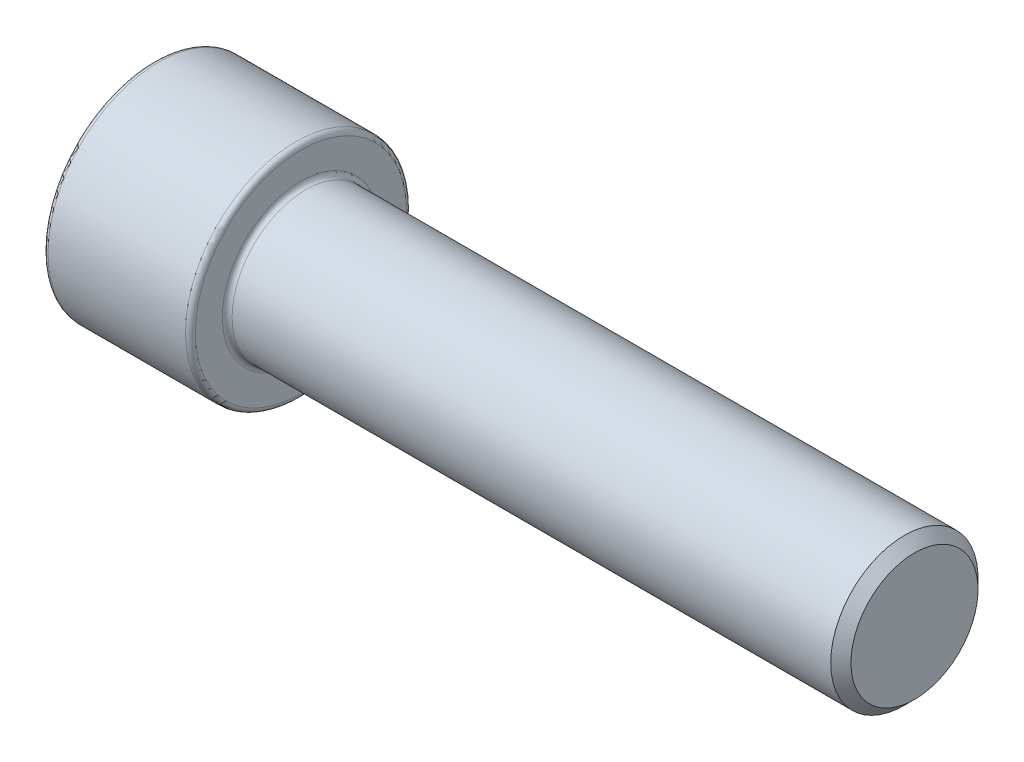
ISO-10303-21;
HEADER;
FILE_DESCRIPTION(('STEP AP214'),'2;1');
FILE_NAME('part.step','',(''),(''),'','','');
FILE_SCHEMA(('AUTOMOTIVE_DESIGN { 1 0 10303 214 1 1 1 1 }'));
ENDSEC;
DATA;
#1=APPLICATION_CONTEXT('core data for automotive mechanical design processes');
#2=APPLICATION_PROTOCOL_DEFINITION('international standard','automotive_design',2000,#1);
#3=PRODUCT_CONTEXT('',#1,'mechanical');
#4=PRODUCT('Part','Part','',(#3));
#5=PRODUCT_RELATED_PRODUCT_CATEGORY('part','',(#4));
#6=PRODUCT_DEFINITION_FORMATION('','',#4);
#7=PRODUCT_DEFINITION_CONTEXT('part definition',#1,'design');
#8=PRODUCT_DEFINITION('design','',#6,#7);
#9=PRODUCT_DEFINITION_SHAPE('','',#8);
#10=(LENGTH_UNIT() NAMED_UNIT(*) SI_UNIT(.MILLI.,.METRE.));
#11=(NAMED_UNIT(*) PLANE_ANGLE_UNIT() SI_UNIT($,.RADIAN.));
#12=(NAMED_UNIT(*) SI_UNIT($,.STERADIAN.) SOLID_ANGLE_UNIT());
#13=UNCERTAINTY_MEASURE_WITH_UNIT(LENGTH_MEASURE(1.E-05),#10,'distance_accuracy_value','');
#14=(GEOMETRIC_REPRESENTATION_CONTEXT(3) GLOBAL_UNCERTAINTY_ASSIGNED_CONTEXT((#13)) GLOBAL_UNIT_ASSIGNED_CONTEXT((#10,
#11,#12)) REPRESENTATION_CONTEXT('',''));
#15=CARTESIAN_POINT('',(0.,0.,0.));
#16=DIRECTION('',(0.,0.,1.));
#17=DIRECTION('',(1.,0.,0.));
#18=AXIS2_PLACEMENT_3D('',#15,#16,#17);
#19=CARTESIAN_POINT('',(12.,10.9696551146029,0.));
#20=DIRECTION('',(1.,0.,0.));
#21=DIRECTION('',(0.,0.,-1.));
#22=AXIS2_PLACEMENT_3D('',#19,#20,#21);
#23=PLANE('',#22);
#24=CARTESIAN_POINT('',(12.,0.,0.));
#25=DIRECTION('',(1.,0.,0.));
#26=DIRECTION('',(0.,0.,-1.));
#27=AXIS2_PLACEMENT_3D('',#24,#25,#26);
#28=CIRCLE('',#27,9.5);
#29=CARTESIAN_POINT('',(12.,0.,-9.5));
#30=VERTEX_POINT('',#29);
#31=CARTESIAN_POINT('',(12.,-8.22724133595217,-4.75));
#32=VERTEX_POINT('',#31);
#33=EDGE_CURVE('E158',#30,#32,#28,.F.);
#34=ORIENTED_EDGE('',*,*,#33,.F.);
#35=DIRECTION('',(0.,1.,0.));
#36=VECTOR('',#35,1.);
#37=CARTESIAN_POINT('',(12.,-5.48482755730145,-9.5));
#38=LINE('',#37,#36);
#39=CARTESIAN_POINT('',(12.,-5.48482755730145,-9.5));
#40=VERTEX_POINT('',#39);
#41=EDGE_CURVE('E189',#40,#30,#38,.T.);
#42=ORIENTED_EDGE('',*,*,#41,.F.);
#43=DIRECTION('',(0.,0.5,-0.866025403784439));
#44=VECTOR('',#43,1.);
#45=CARTESIAN_POINT('',(12.,-10.9696551146029,0.));
#46=LINE('',#45,#44);
#47=EDGE_CURVE('E185',#32,#40,#46,.T.);
#48=ORIENTED_EDGE('',*,*,#47,.F.);
#49=EDGE_LOOP('',(#34,#42,#48));
#50=FACE_BOUND('',#49,.T.);
#51=ADVANCED_FACE('F34',(#50),#23,.F.);
#52=CARTESIAN_POINT('',(12.,-8.22724133595217,4.75));
#53=VERTEX_POINT('',#52);
#54=EDGE_CURVE('E287',#32,#53,#28,.F.);
#55=ORIENTED_EDGE('',*,*,#54,.F.);
#56=CARTESIAN_POINT('',(12.,-10.9696551146029,0.));
#57=VERTEX_POINT('',#56);
#58=EDGE_CURVE('E186',#57,#32,#46,.T.);
#59=ORIENTED_EDGE('',*,*,#58,.F.);
#60=DIRECTION('',(0.,-0.5,-0.866025403784439));
#61=VECTOR('',#60,1.);
#62=CARTESIAN_POINT('',(12.,-5.48482755730145,9.5));
#63=LINE('',#62,#61);
#64=EDGE_CURVE('E181',#53,#57,#63,.T.);
#65=ORIENTED_EDGE('',*,*,#64,.F.);
#66=EDGE_LOOP('',(#55,#59,#65));
#67=FACE_BOUND('',#66,.T.);
#68=ADVANCED_FACE('F125',(#67),#23,.F.);
#69=CARTESIAN_POINT('',(12.,0.,9.5));
#70=VERTEX_POINT('',#69);
#71=EDGE_CURVE('E288',#53,#70,#28,.F.);
#72=ORIENTED_EDGE('',*,*,#71,.F.);
#73=CARTESIAN_POINT('',(12.,-5.48482755730145,9.5));
#74=VERTEX_POINT('',#73);
#75=EDGE_CURVE('E182',#74,#53,#63,.T.);
#76=ORIENTED_EDGE('',*,*,#75,.F.);
#77=DIRECTION('',(0.,-1.,0.));
#78=VECTOR('',#77,1.);
#79=CARTESIAN_POINT('',(12.,5.48482755730145,9.5));
#80=LINE('',#79,#78);
#81=EDGE_CURVE('E177',#70,#74,#80,.T.);
#82=ORIENTED_EDGE('',*,*,#81,.F.);
#83=EDGE_LOOP('',(#72,#76,#82));
#84=FACE_BOUND('',#83,.T.);
#85=ADVANCED_FACE('F131',(#84),#23,.F.);
#86=CARTESIAN_POINT('',(12.,8.22724133595217,4.75));
#87=VERTEX_POINT('',#86);
#88=EDGE_CURVE('E290',#70,#87,#28,.F.);
#89=ORIENTED_EDGE('',*,*,#88,.F.);
#90=CARTESIAN_POINT('',(12.,5.48482755730145,9.5));
#91=VERTEX_POINT('',#90);
#92=EDGE_CURVE('E178',#91,#70,#80,.T.);
#93=ORIENTED_EDGE('',*,*,#92,.F.);
#94=DIRECTION('',(0.,-0.5,0.866025403784439));
#95=VECTOR('',#94,1.);
#96=CARTESIAN_POINT('',(12.,10.9696551146029,0.));
#97=LINE('',#96,#95);
#98=EDGE_CURVE('E172',#87,#91,#97,.T.);
#99=ORIENTED_EDGE('',*,*,#98,.F.);
#100=EDGE_LOOP('',(#89,#93,#99));
#101=FACE_BOUND('',#100,.T.);
#102=ADVANCED_FACE('F146',(#101),#23,.F.);
#103=CARTESIAN_POINT('',(12.,8.22724133595217,-4.75));
#104=VERTEX_POINT('',#103);
#105=EDGE_CURVE('E49',#87,#104,#28,.F.);
#106=ORIENTED_EDGE('',*,*,#105,.F.);
#107=CARTESIAN_POINT('',(12.,10.9696551146029,0.));
#108=VERTEX_POINT('',#107);
#109=EDGE_CURVE('E163',#108,#87,#97,.T.);
#110=ORIENTED_EDGE('',*,*,#109,.F.);
#111=DIRECTION('',(0.,0.5,0.866025403784439));
#112=VECTOR('',#111,1.);
#113=CARTESIAN_POINT('',(12.,5.48482755730145,-9.5));
#114=LINE('',#113,#112);
#115=EDGE_CURVE('E160',#104,#108,#114,.T.);
#116=ORIENTED_EDGE('',*,*,#115,.F.);
#117=EDGE_LOOP('',(#106,#110,#116));
#118=FACE_BOUND('',#117,.T.);
#119=ADVANCED_FACE('F137',(#118),#23,.F.);
#120=EDGE_CURVE('E150',#104,#30,#28,.F.);
#121=ORIENTED_EDGE('',*,*,#120,.F.);
#122=CARTESIAN_POINT('',(12.,5.48482755730145,-9.5));
#123=VERTEX_POINT('',#122);
#124=EDGE_CURVE('E153',#123,#104,#114,.T.);
#125=ORIENTED_EDGE('',*,*,#124,.F.);
#126=EDGE_CURVE('E154',#30,#123,#38,.T.);
#127=ORIENTED_EDGE('',*,*,#126,.F.);
#128=EDGE_LOOP('',(#121,#125,#127));
#129=FACE_BOUND('',#128,.T.);
#130=ADVANCED_FACE('F127',(#129),#23,.F.);
#131=CARTESIAN_POINT('',(0.,0.,0.));
#132=DIRECTION('',(1.,0.,0.));
#133=DIRECTION('',(0.,0.,-1.));
#134=AXIS2_PLACEMENT_3D('',#131,#132,#133);
#135=PLANE('',#134);
#136=CARTESIAN_POINT('',(0.,0.,0.));
#137=DIRECTION('',(1.,0.,0.));
#138=DIRECTION('',(0.,0.,-1.));
#139=AXIS2_PLACEMENT_3D('',#136,#137,#138);
#140=CIRCLE('',#139,17.2);
#141=CARTESIAN_POINT('',(0.,0.,-17.2));
#142=VERTEX_POINT('',#141);
#143=EDGE_CURVE('E42',#142,#142,#140,.F.);
#144=ORIENTED_EDGE('',*,*,#143,.T.);
#145=EDGE_LOOP('',(#144));
#146=FACE_BOUND('',#145,.T.);
#147=DIRECTION('',(0.,0.5,0.866025403784439));
#148=VECTOR('',#147,1.);
#149=CARTESIAN_POINT('',(0.,5.48482755730145,-9.5));
#150=LINE('',#149,#148);
#151=CARTESIAN_POINT('',(0.,5.48482755730145,-9.5));
#152=VERTEX_POINT('',#151);
#153=CARTESIAN_POINT('',(0.,10.9696551146029,0.));
#154=VERTEX_POINT('',#153);
#155=EDGE_CURVE('E191',#152,#154,#150,.T.);
#156=ORIENTED_EDGE('',*,*,#155,.T.);
#157=DIRECTION('',(0.,-0.5,0.866025403784439));
#158=VECTOR('',#157,1.);
#159=CARTESIAN_POINT('',(0.,10.9696551146029,0.));
#160=LINE('',#159,#158);
#161=CARTESIAN_POINT('',(0.,5.48482755730145,9.5));
#162=VERTEX_POINT('',#161);
#163=EDGE_CURVE('E193',#154,#162,#160,.T.);
#164=ORIENTED_EDGE('',*,*,#163,.T.);
#165=DIRECTION('',(0.,-1.,0.));
#166=VECTOR('',#165,1.);
#167=CARTESIAN_POINT('',(0.,5.48482755730145,9.5));
#168=LINE('',#167,#166);
#169=CARTESIAN_POINT('',(0.,-5.48482755730145,9.5));
#170=VERTEX_POINT('',#169);
#171=EDGE_CURVE('E195',#162,#170,#168,.T.);
#172=ORIENTED_EDGE('',*,*,#171,.T.);
#173=DIRECTION('',(0.,-0.5,-0.866025403784439));
#174=VECTOR('',#173,1.);
#175=CARTESIAN_POINT('',(0.,-5.48482755730145,9.5));
#176=LINE('',#175,#174);
#177=CARTESIAN_POINT('',(0.,-10.9696551146029,0.));
#178=VERTEX_POINT('',#177);
#179=EDGE_CURVE('E197',#170,#178,#176,.T.);
#180=ORIENTED_EDGE('',*,*,#179,.T.);
#181=DIRECTION('',(0.,0.5,-0.866025403784439));
#182=VECTOR('',#181,1.);
#183=CARTESIAN_POINT('',(0.,-10.9696551146029,0.));
#184=LINE('',#183,#182);
#185=CARTESIAN_POINT('',(0.,-5.48482755730145,-9.5));
#186=VERTEX_POINT('',#185);
#187=EDGE_CURVE('E199',#178,#186,#184,.T.);
#188=ORIENTED_EDGE('',*,*,#187,.T.);
#189=DIRECTION('',(0.,1.,0.));
#190=VECTOR('',#189,1.);
#191=CARTESIAN_POINT('',(0.,-5.48482755730145,-9.5));
#192=LINE('',#191,#190);
#193=EDGE_CURVE('E57',#186,#152,#192,.T.);
#194=ORIENTED_EDGE('',*,*,#193,.T.);
#195=EDGE_LOOP('',(#156,#164,#172,#180,#188,#194));
#196=FACE_BOUND('',#195,.T.);
#197=ADVANCED_FACE('F136',(#146,#196),#135,.F.);
#198=CARTESIAN_POINT('',(24.,0.,0.));
#199=DIRECTION('',(1.,0.,0.));
#200=DIRECTION('',(0.,0.,-1.));
#201=AXIS2_PLACEMENT_3D('',#198,#199,#200);
#202=PLANE('',#201);
#203=CARTESIAN_POINT('',(24.,0.,0.));
#204=DIRECTION('',(1.,0.,0.));
#205=DIRECTION('',(0.,0.,-1.));
#206=AXIS2_PLACEMENT_3D('',#203,#204,#205);
#207=CIRCLE('',#206,17.2);
#208=CARTESIAN_POINT('',(24.,0.,-17.2));
#209=VERTEX_POINT('',#208);
#210=EDGE_CURVE('E225',#209,#209,#207,.T.);
#211=ORIENTED_EDGE('',*,*,#210,.T.);
#212=EDGE_LOOP('',(#211));
#213=FACE_BOUND('',#212,.T.);
#214=CARTESIAN_POINT('',(24.,0.,0.));
#215=DIRECTION('',(1.,0.,0.));
#216=DIRECTION('',(0.,0.,-1.));
#217=AXIS2_PLACEMENT_3D('',#214,#215,#216);
#218=CIRCLE('',#217,12.8);
#219=CARTESIAN_POINT('',(24.,0.,-12.8));
#220=VERTEX_POINT('',#219);
#221=EDGE_CURVE('E222',#220,#220,#218,.F.);
#222=ORIENTED_EDGE('',*,*,#221,.T.);
#223=EDGE_LOOP('',(#222));
#224=FACE_BOUND('',#223,.T.);
#225=ADVANCED_FACE('F143',(#213,#224),#202,.T.);
#226=CARTESIAN_POINT('',(24.,0.,0.));
#227=DIRECTION('',(-1.,0.,0.));
#228=DIRECTION('',(0.,0.,1.));
#229=AXIS2_PLACEMENT_3D('',#226,#227,#228);
#230=CYLINDRICAL_SURFACE('',#229,18.);
#231=CARTESIAN_POINT('',(23.2,0.,0.));
#232=DIRECTION('',(1.,0.,0.));
#233=DIRECTION('',(0.,0.,-1.));
#234=AXIS2_PLACEMENT_3D('',#231,#232,#233);
#235=CIRCLE('',#234,18.);
#236=CARTESIAN_POINT('',(23.2,0.,-18.));
#237=VERTEX_POINT('',#236);
#238=EDGE_CURVE('E231',#237,#237,#235,.F.);
#239=ORIENTED_EDGE('',*,*,#238,.T.);
#240=EDGE_LOOP('',(#239));
#241=FACE_BOUND('',#240,.T.);
#242=CARTESIAN_POINT('',(0.799999999999999,0.,0.));
#243=DIRECTION('',(1.,0.,0.));
#244=DIRECTION('',(0.,0.,-1.));
#245=AXIS2_PLACEMENT_3D('',#242,#243,#244);
#246=CIRCLE('',#245,18.);
#247=CARTESIAN_POINT('',(0.799999999999999,0.,-18.));
#248=VERTEX_POINT('',#247);
#249=EDGE_CURVE('E228',#248,#248,#246,.T.);
#250=ORIENTED_EDGE('',*,*,#249,.T.);
#251=EDGE_LOOP('',(#250));
#252=FACE_BOUND('',#251,.T.);
#253=ADVANCED_FACE('F240',(#241,#252),#230,.T.);
#254=CARTESIAN_POINT('',(0.,0.,0.));
#255=DIRECTION('',(-1.,0.,0.));
#256=DIRECTION('',(0.,0.,1.));
#257=AXIS2_PLACEMENT_3D('',#254,#255,#256);
#258=CYLINDRICAL_SURFACE('',#257,12.);
#259=CARTESIAN_POINT('',(24.8,0.,0.));
#260=DIRECTION('',(1.,0.,0.));
#261=DIRECTION('',(0.,0.,-1.));
#262=AXIS2_PLACEMENT_3D('',#259,#260,#261);
#263=CIRCLE('',#262,12.);
#264=CARTESIAN_POINT('',(24.8,0.,-12.));
#265=VERTEX_POINT('',#264);
#266=EDGE_CURVE('E11',#265,#265,#263,.T.);
#267=ORIENTED_EDGE('',*,*,#266,.T.);
#268=EDGE_LOOP('',(#267));
#269=FACE_BOUND('',#268,.T.);
#270=CARTESIAN_POINT('',(122.352,0.,0.));
#271=DIRECTION('',(-1.,0.,0.));
#272=DIRECTION('',(0.,0.,1.));
#273=AXIS2_PLACEMENT_3D('',#270,#271,#272);
#274=CIRCLE('',#273,12.);
#275=CARTESIAN_POINT('',(122.352,0.,12.));
#276=VERTEX_POINT('',#275);
#277=EDGE_CURVE('E156',#276,#276,#274,.T.);
#278=ORIENTED_EDGE('',*,*,#277,.T.);
#279=EDGE_LOOP('',(#278));
#280=FACE_BOUND('',#279,.T.);
#281=ADVANCED_FACE('F242',(#269,#280),#258,.T.);
#282=CARTESIAN_POINT('',(124.,0.,0.));
#283=DIRECTION('',(-1.,0.,0.));
#284=DIRECTION('',(0.,0.,1.));
#285=AXIS2_PLACEMENT_3D('',#282,#283,#284);
#286=CONICAL_SURFACE('',#285,10.352,0.785398163397448);
#287=ORIENTED_EDGE('',*,*,#277,.F.);
#288=EDGE_LOOP('',(#287));
#289=FACE_BOUND('',#288,.T.);
#290=CARTESIAN_POINT('',(124.,0.,0.));
#291=DIRECTION('',(-1.,0.,0.));
#292=DIRECTION('',(0.,0.,1.));
#293=AXIS2_PLACEMENT_3D('',#290,#291,#292);
#294=CIRCLE('',#293,10.352);
#295=CARTESIAN_POINT('',(124.,0.,10.352));
#296=VERTEX_POINT('',#295);
#297=EDGE_CURVE('E217',#296,#296,#294,.T.);
#298=ORIENTED_EDGE('',*,*,#297,.T.);
#299=EDGE_LOOP('',(#298));
#300=FACE_BOUND('',#299,.T.);
#301=ADVANCED_FACE('F249',(#289,#300),#286,.T.);
#302=CARTESIAN_POINT('',(124.,0.,0.));
#303=DIRECTION('',(-1.,0.,0.));
#304=DIRECTION('',(0.,0.,1.));
#305=AXIS2_PLACEMENT_3D('',#302,#303,#304);
#306=PLANE('',#305);
#307=ORIENTED_EDGE('',*,*,#297,.F.);
#308=EDGE_LOOP('',(#307));
#309=FACE_BOUND('',#308,.T.);
#310=ADVANCED_FACE('F257',(#309),#306,.F.);
#311=CARTESIAN_POINT('',(12.,5.48482755730145,-9.5));
#312=DIRECTION('',(0.,-0.866025403784438,0.5));
#313=DIRECTION('',(0.,-0.5,-0.866025403784439));
#314=AXIS2_PLACEMENT_3D('',#311,#312,#313);
#315=PLANE('',#314);
#316=ORIENTED_EDGE('',*,*,#124,.T.);
#317=ORIENTED_EDGE('',*,*,#115,.T.);
#318=DIRECTION('',(-1.,0.,0.));
#319=VECTOR('',#318,1.);
#320=CARTESIAN_POINT('',(12.,10.9696551146029,0.));
#321=LINE('',#320,#319);
#322=EDGE_CURVE('E215',#108,#154,#321,.T.);
#323=ORIENTED_EDGE('',*,*,#322,.T.);
#324=ORIENTED_EDGE('',*,*,#155,.F.);
#325=DIRECTION('',(-1.,0.,0.));
#326=VECTOR('',#325,1.);
#327=CARTESIAN_POINT('',(12.,5.48482755730145,-9.5));
#328=LINE('',#327,#326);
#329=EDGE_CURVE('E171',#123,#152,#328,.T.);
#330=ORIENTED_EDGE('',*,*,#329,.F.);
#331=EDGE_LOOP('',(#316,#317,#323,#324,#330));
#332=FACE_BOUND('',#331,.T.);
#333=ADVANCED_FACE('F169',(#332),#315,.T.);
#334=CARTESIAN_POINT('',(12.,10.9696551146029,0.));
#335=DIRECTION('',(0.,-0.866025403784439,-0.5));
#336=DIRECTION('',(0.,0.5,-0.866025403784439));
#337=AXIS2_PLACEMENT_3D('',#334,#335,#336);
#338=PLANE('',#337);
#339=ORIENTED_EDGE('',*,*,#109,.T.);
#340=ORIENTED_EDGE('',*,*,#98,.T.);
#341=DIRECTION('',(-1.,0.,0.));
#342=VECTOR('',#341,1.);
#343=CARTESIAN_POINT('',(12.,5.48482755730145,9.5));
#344=LINE('',#343,#342);
#345=EDGE_CURVE('E212',#91,#162,#344,.T.);
#346=ORIENTED_EDGE('',*,*,#345,.T.);
#347=ORIENTED_EDGE('',*,*,#163,.F.);
#348=ORIENTED_EDGE('',*,*,#322,.F.);
#349=EDGE_LOOP('',(#339,#340,#346,#347,#348));
#350=FACE_BOUND('',#349,.T.);
#351=ADVANCED_FACE('F264',(#350),#338,.T.);
#352=CARTESIAN_POINT('',(12.,5.48482755730145,9.5));
#353=DIRECTION('',(0.,0.,-1.));
#354=DIRECTION('',(-1.,0.,0.));
#355=AXIS2_PLACEMENT_3D('',#352,#353,#354);
#356=PLANE('',#355);
#357=ORIENTED_EDGE('',*,*,#92,.T.);
#358=ORIENTED_EDGE('',*,*,#81,.T.);
#359=DIRECTION('',(-1.,0.,0.));
#360=VECTOR('',#359,1.);
#361=CARTESIAN_POINT('',(12.,-5.48482755730145,9.5));
#362=LINE('',#361,#360);
#363=EDGE_CURVE('E209',#74,#170,#362,.T.);
#364=ORIENTED_EDGE('',*,*,#363,.T.);
#365=ORIENTED_EDGE('',*,*,#171,.F.);
#366=ORIENTED_EDGE('',*,*,#345,.F.);
#367=EDGE_LOOP('',(#357,#358,#364,#365,#366));
#368=FACE_BOUND('',#367,.T.);
#369=ADVANCED_FACE('F267',(#368),#356,.T.);
#370=CARTESIAN_POINT('',(12.,-5.48482755730145,9.5));
#371=DIRECTION('',(0.,0.866025403784438,-0.5));
#372=DIRECTION('',(0.,0.5,0.866025403784439));
#373=AXIS2_PLACEMENT_3D('',#370,#371,#372);
#374=PLANE('',#373);
#375=ORIENTED_EDGE('',*,*,#75,.T.);
#376=ORIENTED_EDGE('',*,*,#64,.T.);
#377=DIRECTION('',(-1.,0.,0.));
#378=VECTOR('',#377,1.);
#379=CARTESIAN_POINT('',(12.,-10.9696551146029,0.));
#380=LINE('',#379,#378);
#381=EDGE_CURVE('E206',#57,#178,#380,.T.);
#382=ORIENTED_EDGE('',*,*,#381,.T.);
#383=ORIENTED_EDGE('',*,*,#179,.F.);
#384=ORIENTED_EDGE('',*,*,#363,.F.);
#385=EDGE_LOOP('',(#375,#376,#382,#383,#384));
#386=FACE_BOUND('',#385,.T.);
#387=ADVANCED_FACE('F271',(#386),#374,.T.);
#388=CARTESIAN_POINT('',(12.,-10.9696551146029,0.));
#389=DIRECTION('',(0.,0.866025403784439,0.5));
#390=DIRECTION('',(0.,-0.5,0.866025403784439));
#391=AXIS2_PLACEMENT_3D('',#388,#389,#390);
#392=PLANE('',#391);
#393=ORIENTED_EDGE('',*,*,#58,.T.);
#394=ORIENTED_EDGE('',*,*,#47,.T.);
#395=DIRECTION('',(-1.,0.,0.));
#396=VECTOR('',#395,1.);
#397=CARTESIAN_POINT('',(12.,-5.48482755730145,-9.5));
#398=LINE('',#397,#396);
#399=EDGE_CURVE('E203',#40,#186,#398,.T.);
#400=ORIENTED_EDGE('',*,*,#399,.T.);
#401=ORIENTED_EDGE('',*,*,#187,.F.);
#402=ORIENTED_EDGE('',*,*,#381,.F.);
#403=EDGE_LOOP('',(#393,#394,#400,#401,#402));
#404=FACE_BOUND('',#403,.T.);
#405=ADVANCED_FACE('F275',(#404),#392,.T.);
#406=CARTESIAN_POINT('',(12.,-5.48482755730145,-9.5));
#407=DIRECTION('',(0.,0.,1.));
#408=DIRECTION('',(1.,0.,0.));
#409=AXIS2_PLACEMENT_3D('',#406,#407,#408);
#410=PLANE('',#409);
#411=ORIENTED_EDGE('',*,*,#41,.T.);
#412=ORIENTED_EDGE('',*,*,#126,.T.);
#413=ORIENTED_EDGE('',*,*,#329,.T.);
#414=ORIENTED_EDGE('',*,*,#193,.F.);
#415=ORIENTED_EDGE('',*,*,#399,.F.);
#416=EDGE_LOOP('',(#411,#412,#413,#414,#415));
#417=FACE_BOUND('',#416,.T.);
#418=ADVANCED_FACE('F119',(#417),#410,.T.);
#419=CARTESIAN_POINT('',(0.,0.,0.));
#420=DIRECTION('',(-1.,0.,0.));
#421=DIRECTION('',(0.,0.,1.));
#422=AXIS2_PLACEMENT_3D('',#419,#420,#421);
#423=CYLINDRICAL_SURFACE('',#422,9.5);
#424=CARTESIAN_POINT('',(13.6,0.,0.));
#425=DIRECTION('',(-1.,0.,0.));
#426=DIRECTION('',(0.,0.,1.));
#427=AXIS2_PLACEMENT_3D('',#424,#425,#426);
#428=CIRCLE('',#427,9.5);
#429=CARTESIAN_POINT('',(13.6,0.,9.5));
#430=VERTEX_POINT('',#429);
#431=EDGE_CURVE('E175',#430,#430,#428,.T.);
#432=ORIENTED_EDGE('',*,*,#431,.F.);
#433=EDGE_LOOP('',(#432));
#434=FACE_BOUND('',#433,.T.);
#435=ORIENTED_EDGE('',*,*,#33,.T.);
#436=ORIENTED_EDGE('',*,*,#54,.T.);
#437=ORIENTED_EDGE('',*,*,#71,.T.);
#438=ORIENTED_EDGE('',*,*,#88,.T.);
#439=ORIENTED_EDGE('',*,*,#105,.T.);
#440=ORIENTED_EDGE('',*,*,#120,.T.);
#441=EDGE_LOOP('',(#435,#436,#437,#438,#439,#440));
#442=FACE_BOUND('',#441,.T.);
#443=ADVANCED_FACE('F109',(#434,#442),#423,.F.);
#444=CARTESIAN_POINT('',(19.0848275573015,0.,0.));
#445=DIRECTION('',(-1.,0.,0.));
#446=DIRECTION('',(0.,0.,1.));
#447=AXIS2_PLACEMENT_3D('',#444,#445,#446);
#448=CONICAL_SURFACE('',#447,0.,1.04719755119659);
#449=ORIENTED_EDGE('',*,*,#431,.T.);
#450=EDGE_LOOP('',(#449));
#451=FACE_BOUND('',#450,.T.);
#452=CARTESIAN_POINT('',(19.0848275573015,0.,0.));
#453=VERTEX_POINT('',#452);
#454=VERTEX_LOOP('',#453);
#455=FACE_BOUND('',#454,.T.);
#456=ADVANCED_FACE('F106',(#451,#455),#448,.F.);
#457=CARTESIAN_POINT('',(23.2,0.,0.));
#458=DIRECTION('',(1.,0.,0.));
#459=DIRECTION('',(0.,0.,-1.));
#460=AXIS2_PLACEMENT_3D('',#457,#458,#459);
#461=TOROIDAL_SURFACE('',#460,17.2,0.8);
#462=ORIENTED_EDGE('',*,*,#238,.F.);
#463=EDGE_LOOP('',(#462));
#464=FACE_BOUND('',#463,.T.);
#465=ORIENTED_EDGE('',*,*,#210,.F.);
#466=EDGE_LOOP('',(#465));
#467=FACE_BOUND('',#466,.T.);
#468=ADVANCED_FACE('F108',(#464,#467),#461,.T.);
#469=CARTESIAN_POINT('',(0.799999999999999,0.,0.));
#470=DIRECTION('',(1.,0.,0.));
#471=DIRECTION('',(0.,0.,-1.));
#472=AXIS2_PLACEMENT_3D('',#469,#470,#471);
#473=TOROIDAL_SURFACE('',#472,17.2,0.8);
#474=ORIENTED_EDGE('',*,*,#143,.F.);
#475=EDGE_LOOP('',(#474));
#476=FACE_BOUND('',#475,.T.);
#477=ORIENTED_EDGE('',*,*,#249,.F.);
#478=EDGE_LOOP('',(#477));
#479=FACE_BOUND('',#478,.T.);
#480=ADVANCED_FACE('F116',(#476,#479),#473,.T.);
#481=CARTESIAN_POINT('',(24.8,0.,0.));
#482=DIRECTION('',(1.,0.,0.));
#483=DIRECTION('',(0.,0.,-1.));
#484=AXIS2_PLACEMENT_3D('',#481,#482,#483);
#485=TOROIDAL_SURFACE('',#484,12.8,0.8);
#486=ORIENTED_EDGE('',*,*,#266,.F.);
#487=EDGE_LOOP('',(#486));
#488=FACE_BOUND('',#487,.T.);
#489=ORIENTED_EDGE('',*,*,#221,.F.);
#490=EDGE_LOOP('',(#489));
#491=FACE_BOUND('',#490,.T.);
#492=ADVANCED_FACE('F36',(#488,#491),#485,.F.);
#493=CLOSED_SHELL('',(#51,#68,#85,#102,#119,#130,#197,#225,#253,#281,#301,#310,#333,#351,#369,
#387,#405,#418,#443,#456,#468,#480,#492));
#494=MANIFOLD_SOLID_BREP('B2',#493);
#495=ADVANCED_BREP_SHAPE_REPRESENTATION('',(#18,#494),#14);
#496=SHAPE_DEFINITION_REPRESENTATION(#9,#495);
ENDSEC;
END-ISO-10303-21;
